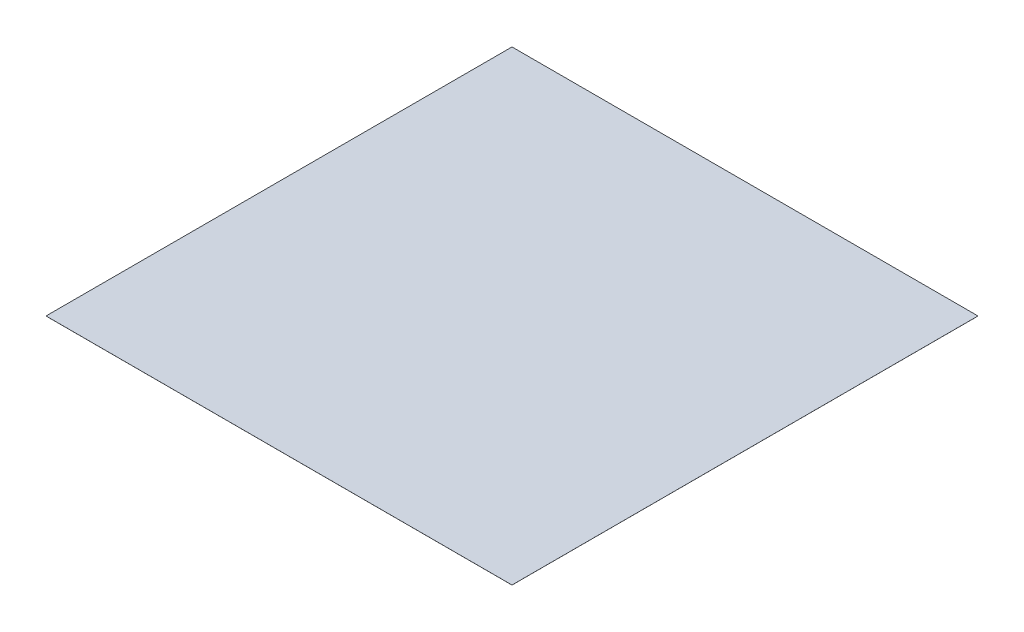
ISO-10303-21;
HEADER;
FILE_DESCRIPTION(('STEP AP214'),'2;1');
FILE_NAME('part.step','',(''),(''),'','','');
FILE_SCHEMA(('AUTOMOTIVE_DESIGN { 1 0 10303 214 1 1 1 1 }'));
ENDSEC;
DATA;
#1=APPLICATION_CONTEXT('core data for automotive mechanical design processes');
#2=APPLICATION_PROTOCOL_DEFINITION('international standard','automotive_design',2000,#1);
#3=PRODUCT_CONTEXT('',#1,'mechanical');
#4=PRODUCT('Part','Part','',(#3));
#5=PRODUCT_RELATED_PRODUCT_CATEGORY('part','',(#4));
#6=PRODUCT_DEFINITION_FORMATION('','',#4);
#7=PRODUCT_DEFINITION_CONTEXT('part definition',#1,'design');
#8=PRODUCT_DEFINITION('design','',#6,#7);
#9=PRODUCT_DEFINITION_SHAPE('','',#8);
#10=(LENGTH_UNIT() NAMED_UNIT(*) SI_UNIT(.MILLI.,.METRE.));
#11=(NAMED_UNIT(*) PLANE_ANGLE_UNIT() SI_UNIT($,.RADIAN.));
#12=(NAMED_UNIT(*) SI_UNIT($,.STERADIAN.) SOLID_ANGLE_UNIT());
#13=UNCERTAINTY_MEASURE_WITH_UNIT(LENGTH_MEASURE(1.E-05),#10,'distance_accuracy_value','');
#14=(GEOMETRIC_REPRESENTATION_CONTEXT(3) GLOBAL_UNCERTAINTY_ASSIGNED_CONTEXT((#13)) GLOBAL_UNIT_ASSIGNED_CONTEXT((#10,
#11,#12)) REPRESENTATION_CONTEXT('',''));
#15=CARTESIAN_POINT('',(0.,0.,0.));
#16=DIRECTION('',(0.,0.,1.));
#17=DIRECTION('',(1.,0.,0.));
#18=AXIS2_PLACEMENT_3D('',#15,#16,#17);
#19=CARTESIAN_POINT('',(0.,0.0254,0.));
#20=DIRECTION('',(1.,0.,0.));
#21=DIRECTION('',(0.,0.,-1.));
#22=AXIS2_PLACEMENT_3D('',#19,#20,#21);
#23=PLANE('',#22);
#24=DIRECTION('',(0.,0.,1.));
#25=VECTOR('',#24,1.);
#26=CARTESIAN_POINT('',(0.,0.,0.));
#27=LINE('',#26,#25);
#28=CARTESIAN_POINT('',(0.,0.,-254.));
#29=VERTEX_POINT('',#28);
#30=CARTESIAN_POINT('',(0.,0.,0.));
#31=VERTEX_POINT('',#30);
#32=EDGE_CURVE('E107',#29,#31,#27,.T.);
#33=ORIENTED_EDGE('',*,*,#32,.T.);
#34=DIRECTION('',(0.,-1.,0.));
#35=VECTOR('',#34,1.);
#36=CARTESIAN_POINT('',(0.,0.0254,0.));
#37=LINE('',#36,#35);
#38=CARTESIAN_POINT('',(0.,0.0254,0.));
#39=VERTEX_POINT('',#38);
#40=EDGE_CURVE('E11',#39,#31,#37,.T.);
#41=ORIENTED_EDGE('',*,*,#40,.F.);
#42=DIRECTION('',(0.,0.,1.));
#43=VECTOR('',#42,1.);
#44=CARTESIAN_POINT('',(0.,0.0254,0.));
#45=LINE('',#44,#43);
#46=CARTESIAN_POINT('',(0.,0.0254,-254.));
#47=VERTEX_POINT('',#46);
#48=EDGE_CURVE('E91',#47,#39,#45,.T.);
#49=ORIENTED_EDGE('',*,*,#48,.F.);
#50=DIRECTION('',(0.,-1.,0.));
#51=VECTOR('',#50,1.);
#52=CARTESIAN_POINT('',(0.,0.0254,-254.));
#53=LINE('',#52,#51);
#54=EDGE_CURVE('E103',#47,#29,#53,.T.);
#55=ORIENTED_EDGE('',*,*,#54,.T.);
#56=EDGE_LOOP('',(#33,#41,#49,#55));
#57=FACE_BOUND('',#56,.T.);
#58=ADVANCED_FACE('F39',(#57),#23,.F.);
#59=CARTESIAN_POINT('',(0.,0.0254,0.));
#60=DIRECTION('',(0.,0.,-1.));
#61=DIRECTION('',(-1.,0.,0.));
#62=AXIS2_PLACEMENT_3D('',#59,#60,#61);
#63=PLANE('',#62);
#64=DIRECTION('',(1.,0.,0.));
#65=VECTOR('',#64,1.);
#66=CARTESIAN_POINT('',(0.,0.,0.));
#67=LINE('',#66,#65);
#68=CARTESIAN_POINT('',(254.,0.,0.));
#69=VERTEX_POINT('',#68);
#70=EDGE_CURVE('E96',#31,#69,#67,.T.);
#71=ORIENTED_EDGE('',*,*,#70,.T.);
#72=DIRECTION('',(0.,-1.,0.));
#73=VECTOR('',#72,1.);
#74=CARTESIAN_POINT('',(254.,0.0254,0.));
#75=LINE('',#74,#73);
#76=CARTESIAN_POINT('',(254.,0.0254,0.));
#77=VERTEX_POINT('',#76);
#78=EDGE_CURVE('E48',#77,#69,#75,.T.);
#79=ORIENTED_EDGE('',*,*,#78,.F.);
#80=DIRECTION('',(1.,0.,0.));
#81=VECTOR('',#80,1.);
#82=CARTESIAN_POINT('',(0.,0.0254,0.));
#83=LINE('',#82,#81);
#84=EDGE_CURVE('E86',#39,#77,#83,.T.);
#85=ORIENTED_EDGE('',*,*,#84,.F.);
#86=ORIENTED_EDGE('',*,*,#40,.T.);
#87=EDGE_LOOP('',(#71,#79,#85,#86));
#88=FACE_BOUND('',#87,.T.);
#89=ADVANCED_FACE('F95',(#88),#63,.F.);
#90=CARTESIAN_POINT('',(254.,0.0254,0.));
#91=DIRECTION('',(-1.,0.,0.));
#92=DIRECTION('',(0.,0.,1.));
#93=AXIS2_PLACEMENT_3D('',#90,#91,#92);
#94=PLANE('',#93);
#95=DIRECTION('',(0.,0.,-1.));
#96=VECTOR('',#95,1.);
#97=CARTESIAN_POINT('',(254.,0.,0.));
#98=LINE('',#97,#96);
#99=CARTESIAN_POINT('',(254.,0.,-254.));
#100=VERTEX_POINT('',#99);
#101=EDGE_CURVE('E73',#69,#100,#98,.T.);
#102=ORIENTED_EDGE('',*,*,#101,.T.);
#103=DIRECTION('',(0.,-1.,0.));
#104=VECTOR('',#103,1.);
#105=CARTESIAN_POINT('',(254.,0.0254,-254.));
#106=LINE('',#105,#104);
#107=CARTESIAN_POINT('',(254.,0.0254,-254.));
#108=VERTEX_POINT('',#107);
#109=EDGE_CURVE('E98',#108,#100,#106,.T.);
#110=ORIENTED_EDGE('',*,*,#109,.F.);
#111=DIRECTION('',(0.,0.,-1.));
#112=VECTOR('',#111,1.);
#113=CARTESIAN_POINT('',(254.,0.0254,0.));
#114=LINE('',#113,#112);
#115=EDGE_CURVE('E89',#77,#108,#114,.T.);
#116=ORIENTED_EDGE('',*,*,#115,.F.);
#117=ORIENTED_EDGE('',*,*,#78,.T.);
#118=EDGE_LOOP('',(#102,#110,#116,#117));
#119=FACE_BOUND('',#118,.T.);
#120=ADVANCED_FACE('F99',(#119),#94,.F.);
#121=CARTESIAN_POINT('',(0.,0.0254,-254.));
#122=DIRECTION('',(0.,0.,1.));
#123=DIRECTION('',(1.,0.,0.));
#124=AXIS2_PLACEMENT_3D('',#121,#122,#123);
#125=PLANE('',#124);
#126=DIRECTION('',(-1.,0.,0.));
#127=VECTOR('',#126,1.);
#128=CARTESIAN_POINT('',(0.,0.,-254.));
#129=LINE('',#128,#127);
#130=EDGE_CURVE('E79',#100,#29,#129,.T.);
#131=ORIENTED_EDGE('',*,*,#130,.T.);
#132=ORIENTED_EDGE('',*,*,#54,.F.);
#133=DIRECTION('',(-1.,0.,0.));
#134=VECTOR('',#133,1.);
#135=CARTESIAN_POINT('',(0.,0.0254,-254.));
#136=LINE('',#135,#134);
#137=EDGE_CURVE('E56',#108,#47,#136,.T.);
#138=ORIENTED_EDGE('',*,*,#137,.F.);
#139=ORIENTED_EDGE('',*,*,#109,.T.);
#140=EDGE_LOOP('',(#131,#132,#138,#139));
#141=FACE_BOUND('',#140,.T.);
#142=ADVANCED_FACE('F120',(#141),#125,.F.);
#143=CARTESIAN_POINT('',(0.,0.0254,0.));
#144=DIRECTION('',(0.,-1.,0.));
#145=DIRECTION('',(0.,0.,-1.));
#146=AXIS2_PLACEMENT_3D('',#143,#144,#145);
#147=PLANE('',#146);
#148=ORIENTED_EDGE('',*,*,#48,.T.);
#149=ORIENTED_EDGE('',*,*,#84,.T.);
#150=ORIENTED_EDGE('',*,*,#115,.T.);
#151=ORIENTED_EDGE('',*,*,#137,.T.);
#152=EDGE_LOOP('',(#148,#149,#150,#151));
#153=FACE_BOUND('',#152,.T.);
#154=ADVANCED_FACE('F87',(#153),#147,.F.);
#155=CARTESIAN_POINT('',(0.,0.,0.));
#156=DIRECTION('',(0.,-1.,0.));
#157=DIRECTION('',(0.,0.,-1.));
#158=AXIS2_PLACEMENT_3D('',#155,#156,#157);
#159=PLANE('',#158);
#160=ORIENTED_EDGE('',*,*,#32,.F.);
#161=ORIENTED_EDGE('',*,*,#130,.F.);
#162=ORIENTED_EDGE('',*,*,#101,.F.);
#163=ORIENTED_EDGE('',*,*,#70,.F.);
#164=EDGE_LOOP('',(#160,#161,#162,#163));
#165=FACE_BOUND('',#164,.T.);
#166=ADVANCED_FACE('F123',(#165),#159,.T.);
#167=CLOSED_SHELL('',(#58,#89,#120,#142,#154,#166));
#168=MANIFOLD_SOLID_BREP('B2',#167);
#169=ADVANCED_BREP_SHAPE_REPRESENTATION('',(#18,#168),#14);
#170=SHAPE_DEFINITION_REPRESENTATION(#9,#169);
ENDSEC;
END-ISO-10303-21;
